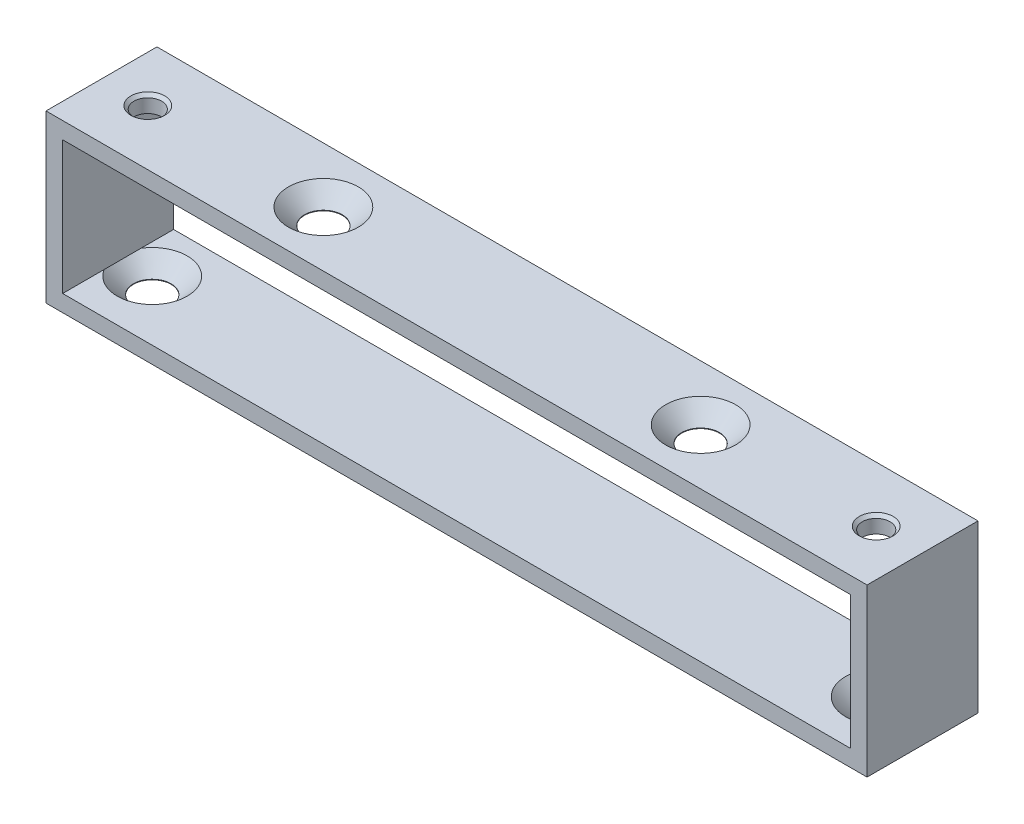
ISO-10303-21;
HEADER;
FILE_DESCRIPTION(('STEP AP214'),'2;1');
FILE_NAME('part.step','',(''),(''),'','','');
FILE_SCHEMA(('AUTOMOTIVE_DESIGN { 1 0 10303 214 1 1 1 1 }'));
ENDSEC;
DATA;
#1=APPLICATION_CONTEXT('core data for automotive mechanical design processes');
#2=APPLICATION_PROTOCOL_DEFINITION('international standard','automotive_design',2000,#1);
#3=PRODUCT_CONTEXT('',#1,'mechanical');
#4=PRODUCT('Part','Part','',(#3));
#5=PRODUCT_RELATED_PRODUCT_CATEGORY('part','',(#4));
#6=PRODUCT_DEFINITION_FORMATION('','',#4);
#7=PRODUCT_DEFINITION_CONTEXT('part definition',#1,'design');
#8=PRODUCT_DEFINITION('design','',#6,#7);
#9=PRODUCT_DEFINITION_SHAPE('','',#8);
#10=(LENGTH_UNIT() NAMED_UNIT(*) SI_UNIT(.MILLI.,.METRE.));
#11=(NAMED_UNIT(*) PLANE_ANGLE_UNIT() SI_UNIT($,.RADIAN.));
#12=(NAMED_UNIT(*) SI_UNIT($,.STERADIAN.) SOLID_ANGLE_UNIT());
#13=UNCERTAINTY_MEASURE_WITH_UNIT(LENGTH_MEASURE(1.E-05),#10,'distance_accuracy_value','');
#14=(GEOMETRIC_REPRESENTATION_CONTEXT(3) GLOBAL_UNCERTAINTY_ASSIGNED_CONTEXT((#13)) GLOBAL_UNIT_ASSIGNED_CONTEXT((#10,
#11,#12)) REPRESENTATION_CONTEXT('',''));
#15=CARTESIAN_POINT('',(0.,0.,0.));
#16=DIRECTION('',(0.,0.,1.));
#17=DIRECTION('',(1.,0.,0.));
#18=AXIS2_PLACEMENT_3D('',#15,#16,#17);
#19=CARTESIAN_POINT('',(-15.1079019313872,-9.8448275862069,-0.000999999999999265));
#20=DIRECTION('',(0.,-1.,0.));
#21=DIRECTION('',(0.,0.,-1.));
#22=AXIS2_PLACEMENT_3D('',#19,#20,#21);
#23=PLANE('',#22);
#24=CARTESIAN_POINT('',(-12.4329019313872,-9.8448275862069,4.6));
#25=DIRECTION('',(0.,1.,0.));
#26=DIRECTION('',(0.,0.,1.));
#27=AXIS2_PLACEMENT_3D('',#24,#25,#26);
#28=CIRCLE('',#27,3.15);
#29=CARTESIAN_POINT('',(-15.1079019313872,-9.8448275862069,6.26339261751397));
#30=VERTEX_POINT('',#29);
#31=CARTESIAN_POINT('',(-15.1079019313872,-9.8448275862069,2.93660738248603));
#32=VERTEX_POINT('',#31);
#33=EDGE_CURVE('E117',#30,#32,#28,.T.);
#34=ORIENTED_EDGE('',*,*,#33,.F.);
#35=DIRECTION('',(0.,0.,1.));
#36=VECTOR('',#35,1.);
#37=CARTESIAN_POINT('',(-15.1079019313872,-9.8448275862069,-0.000999999999999265));
#38=LINE('',#37,#36);
#39=CARTESIAN_POINT('',(-15.1079019313872,-9.8448275862069,10.));
#40=VERTEX_POINT('',#39);
#41=EDGE_CURVE('E136',#30,#40,#38,.T.);
#42=ORIENTED_EDGE('',*,*,#41,.T.);
#43=DIRECTION('',(1.,0.,0.));
#44=VECTOR('',#43,1.);
#45=CARTESIAN_POINT('',(-15.1079019313872,-9.8448275862069,10.));
#46=LINE('',#45,#44);
#47=CARTESIAN_POINT('',(55.8920980686128,-9.8448275862069,10.));
#48=VERTEX_POINT('',#47);
#49=EDGE_CURVE('E162',#40,#48,#46,.T.);
#50=ORIENTED_EDGE('',*,*,#49,.T.);
#51=DIRECTION('',(0.,0.,1.));
#52=VECTOR('',#51,1.);
#53=CARTESIAN_POINT('',(55.8920980686128,-9.8448275862069,-0.000999999999999265));
#54=LINE('',#53,#52);
#55=CARTESIAN_POINT('',(55.8920980686128,-9.8448275862069,6.26339261751398));
#56=VERTEX_POINT('',#55);
#57=EDGE_CURVE('E144',#56,#48,#54,.T.);
#58=ORIENTED_EDGE('',*,*,#57,.F.);
#59=CARTESIAN_POINT('',(53.2170980686128,-9.8448275862069,4.6));
#60=DIRECTION('',(0.,1.,0.));
#61=DIRECTION('',(0.,0.,1.));
#62=AXIS2_PLACEMENT_3D('',#59,#60,#61);
#63=CIRCLE('',#62,3.15);
#64=CARTESIAN_POINT('',(55.8920980686128,-9.8448275862069,2.93660738248602));
#65=VERTEX_POINT('',#64);
#66=EDGE_CURVE('E181',#65,#56,#63,.T.);
#67=ORIENTED_EDGE('',*,*,#66,.F.);
#68=CARTESIAN_POINT('',(55.8920980686128,-9.8448275862069,0.));
#69=VERTEX_POINT('',#68);
#70=EDGE_CURVE('E148',#69,#65,#54,.T.);
#71=ORIENTED_EDGE('',*,*,#70,.F.);
#72=DIRECTION('',(-1.,0.,0.));
#73=VECTOR('',#72,1.);
#74=CARTESIAN_POINT('',(-15.1079019313872,-9.8448275862069,0.));
#75=LINE('',#74,#73);
#76=CARTESIAN_POINT('',(-15.1079019313872,-9.8448275862069,0.));
#77=VERTEX_POINT('',#76);
#78=EDGE_CURVE('E141',#69,#77,#75,.T.);
#79=ORIENTED_EDGE('',*,*,#78,.T.);
#80=EDGE_CURVE('E133',#77,#32,#38,.T.);
#81=ORIENTED_EDGE('',*,*,#80,.T.);
#82=EDGE_LOOP('',(#34,#42,#50,#58,#67,#71,#79,#81));
#83=FACE_BOUND('',#82,.T.);
#84=ADVANCED_FACE('F41',(#83),#23,.F.);
#85=CARTESIAN_POINT('',(-16.6079019313872,3.6551724137931,10.));
#86=DIRECTION('',(0.,-1.,0.));
#87=DIRECTION('',(0.,0.,-1.));
#88=AXIS2_PLACEMENT_3D('',#85,#86,#87);
#89=PLANE('',#88);
#90=CARTESIAN_POINT('',(-12.4329019313872,3.6551724137931,5.));
#91=DIRECTION('',(0.,1.,0.));
#92=DIRECTION('',(0.,0.,1.));
#93=AXIS2_PLACEMENT_3D('',#90,#91,#92);
#94=CIRCLE('',#93,1.525);
#95=CARTESIAN_POINT('',(-12.4329019313872,3.6551724137931,6.525));
#96=VERTEX_POINT('',#95);
#97=EDGE_CURVE('E211',#96,#96,#94,.T.);
#98=ORIENTED_EDGE('',*,*,#97,.F.);
#99=EDGE_LOOP('',(#98));
#100=FACE_BOUND('',#99,.T.);
#101=DIRECTION('',(-1.,0.,0.));
#102=VECTOR('',#101,1.);
#103=CARTESIAN_POINT('',(-16.6079019313872,3.6551724137931,0.));
#104=LINE('',#103,#102);
#105=CARTESIAN_POINT('',(57.3920980686128,3.6551724137931,0.));
#106=VERTEX_POINT('',#105);
#107=CARTESIAN_POINT('',(-16.6079019313872,3.6551724137931,0.));
#108=VERTEX_POINT('',#107);
#109=EDGE_CURVE('E283',#106,#108,#104,.T.);
#110=ORIENTED_EDGE('',*,*,#109,.T.);
#111=DIRECTION('',(0.,0.,-1.));
#112=VECTOR('',#111,1.);
#113=CARTESIAN_POINT('',(-16.6079019313872,3.6551724137931,10.));
#114=LINE('',#113,#112);
#115=CARTESIAN_POINT('',(-16.6079019313872,3.6551724137931,10.));
#116=VERTEX_POINT('',#115);
#117=EDGE_CURVE('E291',#116,#108,#114,.T.);
#118=ORIENTED_EDGE('',*,*,#117,.F.);
#119=DIRECTION('',(-1.,0.,0.));
#120=VECTOR('',#119,1.);
#121=CARTESIAN_POINT('',(-16.6079019313872,3.6551724137931,10.));
#122=LINE('',#121,#120);
#123=CARTESIAN_POINT('',(57.3920980686128,3.6551724137931,10.));
#124=VERTEX_POINT('',#123);
#125=EDGE_CURVE('E289',#124,#116,#122,.T.);
#126=ORIENTED_EDGE('',*,*,#125,.F.);
#127=DIRECTION('',(0.,0.,-1.));
#128=VECTOR('',#127,1.);
#129=CARTESIAN_POINT('',(57.3920980686128,3.6551724137931,10.));
#130=LINE('',#129,#128);
#131=EDGE_CURVE('E303',#124,#106,#130,.T.);
#132=ORIENTED_EDGE('',*,*,#131,.T.);
#133=EDGE_LOOP('',(#110,#118,#126,#132));
#134=FACE_BOUND('',#133,.T.);
#135=CARTESIAN_POINT('',(37.3920980686128,3.6551724137931,5.));
#136=DIRECTION('',(0.,1.,0.));
#137=DIRECTION('',(0.,0.,1.));
#138=AXIS2_PLACEMENT_3D('',#135,#136,#137);
#139=CIRCLE('',#138,3.15);
#140=CARTESIAN_POINT('',(37.3920980686128,3.6551724137931,8.15));
#141=VERTEX_POINT('',#140);
#142=EDGE_CURVE('E235',#141,#141,#139,.T.);
#143=ORIENTED_EDGE('',*,*,#142,.F.);
#144=EDGE_LOOP('',(#143));
#145=FACE_BOUND('',#144,.T.);
#146=CARTESIAN_POINT('',(3.39209806861276,3.6551724137931,5.));
#147=DIRECTION('',(0.,1.,0.));
#148=DIRECTION('',(0.,0.,1.));
#149=AXIS2_PLACEMENT_3D('',#146,#147,#148);
#150=CIRCLE('',#149,3.15);
#151=CARTESIAN_POINT('',(3.39209806861276,3.6551724137931,8.15));
#152=VERTEX_POINT('',#151);
#153=EDGE_CURVE('E223',#152,#152,#150,.T.);
#154=ORIENTED_EDGE('',*,*,#153,.F.);
#155=EDGE_LOOP('',(#154));
#156=FACE_BOUND('',#155,.T.);
#157=CARTESIAN_POINT('',(53.2170980686128,3.6551724137931,5.));
#158=DIRECTION('',(0.,1.,0.));
#159=DIRECTION('',(0.,0.,1.));
#160=AXIS2_PLACEMENT_3D('',#157,#158,#159);
#161=CIRCLE('',#160,1.525);
#162=CARTESIAN_POINT('',(53.2170980686128,3.6551724137931,6.525));
#163=VERTEX_POINT('',#162);
#164=EDGE_CURVE('E199',#163,#163,#161,.T.);
#165=ORIENTED_EDGE('',*,*,#164,.F.);
#166=EDGE_LOOP('',(#165));
#167=FACE_BOUND('',#166,.T.);
#168=ADVANCED_FACE('F319',(#100,#134,#145,#156,#167),#89,.F.);
#169=CARTESIAN_POINT('',(-16.6079019313872,3.6551724137931,10.));
#170=DIRECTION('',(1.,0.,0.));
#171=DIRECTION('',(0.,1.,0.));
#172=AXIS2_PLACEMENT_3D('',#169,#170,#171);
#173=PLANE('',#172);
#174=DIRECTION('',(0.,-1.,0.));
#175=VECTOR('',#174,1.);
#176=CARTESIAN_POINT('',(-16.6079019313872,3.6551724137931,0.));
#177=LINE('',#176,#175);
#178=CARTESIAN_POINT('',(-16.6079019313872,-11.3448275862069,0.));
#179=VERTEX_POINT('',#178);
#180=EDGE_CURVE('E272',#108,#179,#177,.T.);
#181=ORIENTED_EDGE('',*,*,#180,.T.);
#182=DIRECTION('',(0.,0.,-1.));
#183=VECTOR('',#182,1.);
#184=CARTESIAN_POINT('',(-16.6079019313872,-11.3448275862069,10.));
#185=LINE('',#184,#183);
#186=CARTESIAN_POINT('',(-16.6079019313872,-11.3448275862069,10.));
#187=VERTEX_POINT('',#186);
#188=EDGE_CURVE('E11',#187,#179,#185,.T.);
#189=ORIENTED_EDGE('',*,*,#188,.F.);
#190=DIRECTION('',(0.,-1.,0.));
#191=VECTOR('',#190,1.);
#192=CARTESIAN_POINT('',(-16.6079019313872,3.6551724137931,10.));
#193=LINE('',#192,#191);
#194=EDGE_CURVE('E278',#116,#187,#193,.T.);
#195=ORIENTED_EDGE('',*,*,#194,.F.);
#196=ORIENTED_EDGE('',*,*,#117,.T.);
#197=EDGE_LOOP('',(#181,#189,#195,#196));
#198=FACE_BOUND('',#197,.T.);
#199=ADVANCED_FACE('F43',(#198),#173,.F.);
#200=CARTESIAN_POINT('',(-16.6079019313872,-11.3448275862069,10.));
#201=DIRECTION('',(0.,1.,0.));
#202=DIRECTION('',(0.,0.,1.));
#203=AXIS2_PLACEMENT_3D('',#200,#201,#202);
#204=PLANE('',#203);
#205=CARTESIAN_POINT('',(-12.4329019313872,-11.3448275862069,4.6));
#206=DIRECTION('',(0.,1.,0.));
#207=DIRECTION('',(0.,0.,1.));
#208=AXIS2_PLACEMENT_3D('',#205,#206,#207);
#209=CIRCLE('',#208,1.7);
#210=CARTESIAN_POINT('',(-12.4329019313872,-11.3448275862069,6.3));
#211=VERTEX_POINT('',#210);
#212=EDGE_CURVE('E183',#211,#211,#209,.T.);
#213=ORIENTED_EDGE('',*,*,#212,.T.);
#214=EDGE_LOOP('',(#213));
#215=FACE_BOUND('',#214,.T.);
#216=CARTESIAN_POINT('',(53.2170980686128,-11.3448275862069,4.6));
#217=DIRECTION('',(0.,1.,0.));
#218=DIRECTION('',(0.,0.,1.));
#219=AXIS2_PLACEMENT_3D('',#216,#217,#218);
#220=CIRCLE('',#219,1.7);
#221=CARTESIAN_POINT('',(53.2170980686128,-11.3448275862069,6.3));
#222=VERTEX_POINT('',#221);
#223=EDGE_CURVE('E195',#222,#222,#220,.T.);
#224=ORIENTED_EDGE('',*,*,#223,.T.);
#225=EDGE_LOOP('',(#224));
#226=FACE_BOUND('',#225,.T.);
#227=DIRECTION('',(1.,0.,0.));
#228=VECTOR('',#227,1.);
#229=CARTESIAN_POINT('',(-16.6079019313872,-11.3448275862069,0.));
#230=LINE('',#229,#228);
#231=CARTESIAN_POINT('',(57.3920980686128,-11.3448275862069,0.));
#232=VERTEX_POINT('',#231);
#233=EDGE_CURVE('E275',#179,#232,#230,.T.);
#234=ORIENTED_EDGE('',*,*,#233,.T.);
#235=DIRECTION('',(0.,0.,-1.));
#236=VECTOR('',#235,1.);
#237=CARTESIAN_POINT('',(57.3920980686128,-11.3448275862069,10.));
#238=LINE('',#237,#236);
#239=CARTESIAN_POINT('',(57.3920980686128,-11.3448275862069,10.));
#240=VERTEX_POINT('',#239);
#241=EDGE_CURVE('E50',#240,#232,#238,.T.);
#242=ORIENTED_EDGE('',*,*,#241,.F.);
#243=DIRECTION('',(1.,0.,0.));
#244=VECTOR('',#243,1.);
#245=CARTESIAN_POINT('',(-16.6079019313872,-11.3448275862069,10.));
#246=LINE('',#245,#244);
#247=EDGE_CURVE('E282',#187,#240,#246,.T.);
#248=ORIENTED_EDGE('',*,*,#247,.F.);
#249=ORIENTED_EDGE('',*,*,#188,.T.);
#250=EDGE_LOOP('',(#234,#242,#248,#249));
#251=FACE_BOUND('',#250,.T.);
#252=ADVANCED_FACE('F325',(#215,#226,#251),#204,.F.);
#253=CARTESIAN_POINT('',(57.3920980686128,3.6551724137931,10.));
#254=DIRECTION('',(-1.,0.,0.));
#255=DIRECTION('',(0.,0.,1.));
#256=AXIS2_PLACEMENT_3D('',#253,#254,#255);
#257=PLANE('',#256);
#258=DIRECTION('',(0.,1.,0.));
#259=VECTOR('',#258,1.);
#260=CARTESIAN_POINT('',(57.3920980686128,3.6551724137931,0.));
#261=LINE('',#260,#259);
#262=EDGE_CURVE('E295',#232,#106,#261,.T.);
#263=ORIENTED_EDGE('',*,*,#262,.T.);
#264=ORIENTED_EDGE('',*,*,#131,.F.);
#265=DIRECTION('',(0.,1.,0.));
#266=VECTOR('',#265,1.);
#267=CARTESIAN_POINT('',(57.3920980686128,3.6551724137931,10.));
#268=LINE('',#267,#266);
#269=EDGE_CURVE('E286',#240,#124,#268,.T.);
#270=ORIENTED_EDGE('',*,*,#269,.F.);
#271=ORIENTED_EDGE('',*,*,#241,.T.);
#272=EDGE_LOOP('',(#263,#264,#270,#271));
#273=FACE_BOUND('',#272,.T.);
#274=ADVANCED_FACE('F312',(#273),#257,.F.);
#275=CARTESIAN_POINT('',(0.,0.,10.));
#276=DIRECTION('',(0.,0.,1.));
#277=DIRECTION('',(1.,0.,0.));
#278=AXIS2_PLACEMENT_3D('',#275,#276,#277);
#279=PLANE('',#278);
#280=DIRECTION('',(0.,-1.,0.));
#281=VECTOR('',#280,1.);
#282=CARTESIAN_POINT('',(-15.1079019313872,2.1551724137931,10.));
#283=LINE('',#282,#281);
#284=CARTESIAN_POINT('',(-15.1079019313872,2.1551724137931,10.));
#285=VERTEX_POINT('',#284);
#286=EDGE_CURVE('E257',#285,#40,#283,.T.);
#287=ORIENTED_EDGE('',*,*,#286,.F.);
#288=DIRECTION('',(-1.,0.,0.));
#289=VECTOR('',#288,1.);
#290=CARTESIAN_POINT('',(-15.1079019313872,2.1551724137931,10.));
#291=LINE('',#290,#289);
#292=CARTESIAN_POINT('',(55.8920980686128,2.1551724137931,10.));
#293=VERTEX_POINT('',#292);
#294=EDGE_CURVE('E151',#293,#285,#291,.T.);
#295=ORIENTED_EDGE('',*,*,#294,.F.);
#296=DIRECTION('',(0.,1.,0.));
#297=VECTOR('',#296,1.);
#298=CARTESIAN_POINT('',(55.8920980686128,2.1551724137931,10.));
#299=LINE('',#298,#297);
#300=EDGE_CURVE('E155',#48,#293,#299,.T.);
#301=ORIENTED_EDGE('',*,*,#300,.F.);
#302=ORIENTED_EDGE('',*,*,#49,.F.);
#303=EDGE_LOOP('',(#287,#295,#301,#302));
#304=FACE_BOUND('',#303,.T.);
#305=ORIENTED_EDGE('',*,*,#194,.T.);
#306=ORIENTED_EDGE('',*,*,#247,.T.);
#307=ORIENTED_EDGE('',*,*,#269,.T.);
#308=ORIENTED_EDGE('',*,*,#125,.T.);
#309=EDGE_LOOP('',(#305,#306,#307,#308));
#310=FACE_BOUND('',#309,.T.);
#311=ADVANCED_FACE('F263',(#304,#310),#279,.T.);
#312=CARTESIAN_POINT('',(0.,0.,0.));
#313=DIRECTION('',(0.,0.,1.));
#314=DIRECTION('',(1.,0.,0.));
#315=AXIS2_PLACEMENT_3D('',#312,#313,#314);
#316=PLANE('',#315);
#317=DIRECTION('',(1.,0.,0.));
#318=VECTOR('',#317,1.);
#319=CARTESIAN_POINT('',(-15.1079019313872,2.1551724137931,0.));
#320=LINE('',#319,#318);
#321=CARTESIAN_POINT('',(-15.1079019313872,2.1551724137931,0.));
#322=VERTEX_POINT('',#321);
#323=CARTESIAN_POINT('',(55.8920980686128,2.1551724137931,0.));
#324=VERTEX_POINT('',#323);
#325=EDGE_CURVE('E250',#322,#324,#320,.T.);
#326=ORIENTED_EDGE('',*,*,#325,.F.);
#327=DIRECTION('',(0.,1.,0.));
#328=VECTOR('',#327,1.);
#329=CARTESIAN_POINT('',(-15.1079019313872,2.1551724137931,0.));
#330=LINE('',#329,#328);
#331=EDGE_CURVE('E254',#77,#322,#330,.T.);
#332=ORIENTED_EDGE('',*,*,#331,.F.);
#333=ORIENTED_EDGE('',*,*,#78,.F.);
#334=DIRECTION('',(0.,-1.,0.));
#335=VECTOR('',#334,1.);
#336=CARTESIAN_POINT('',(55.8920980686128,2.1551724137931,0.));
#337=LINE('',#336,#335);
#338=EDGE_CURVE('E247',#324,#69,#337,.T.);
#339=ORIENTED_EDGE('',*,*,#338,.F.);
#340=EDGE_LOOP('',(#326,#332,#333,#339));
#341=FACE_BOUND('',#340,.T.);
#342=ORIENTED_EDGE('',*,*,#180,.F.);
#343=ORIENTED_EDGE('',*,*,#109,.F.);
#344=ORIENTED_EDGE('',*,*,#262,.F.);
#345=ORIENTED_EDGE('',*,*,#233,.F.);
#346=EDGE_LOOP('',(#342,#343,#344,#345));
#347=FACE_BOUND('',#346,.T.);
#348=ADVANCED_FACE('F269',(#341,#347),#316,.F.);
#349=CARTESIAN_POINT('',(-15.1079019313872,2.1551724137931,-0.000999999999999265));
#350=DIRECTION('',(-1.,0.,0.));
#351=DIRECTION('',(0.,-1.,0.));
#352=AXIS2_PLACEMENT_3D('',#349,#350,#351);
#353=PLANE('',#352);
#354=ORIENTED_EDGE('',*,*,#331,.T.);
#355=DIRECTION('',(0.,0.,1.));
#356=VECTOR('',#355,1.);
#357=CARTESIAN_POINT('',(-15.1079019313872,2.1551724137931,-0.000999999999999265));
#358=LINE('',#357,#356);
#359=EDGE_CURVE('E166',#322,#285,#358,.T.);
#360=ORIENTED_EDGE('',*,*,#359,.T.);
#361=ORIENTED_EDGE('',*,*,#286,.T.);
#362=ORIENTED_EDGE('',*,*,#41,.F.);
#363=EDGE_CURVE('E127',#32,#30,#38,.T.);
#364=ORIENTED_EDGE('',*,*,#363,.F.);
#365=ORIENTED_EDGE('',*,*,#80,.F.);
#366=EDGE_LOOP('',(#354,#360,#361,#362,#364,#365));
#367=FACE_BOUND('',#366,.T.);
#368=ADVANCED_FACE('F132',(#367),#353,.F.);
#369=CARTESIAN_POINT('',(-15.1079019313872,2.1551724137931,-0.000999999999999265));
#370=DIRECTION('',(0.,1.,0.));
#371=DIRECTION('',(0.,0.,1.));
#372=AXIS2_PLACEMENT_3D('',#369,#370,#371);
#373=PLANE('',#372);
#374=CARTESIAN_POINT('',(53.2170980686128,2.1551724137931,5.));
#375=DIRECTION('',(0.,1.,0.));
#376=DIRECTION('',(0.,0.,1.));
#377=AXIS2_PLACEMENT_3D('',#374,#375,#376);
#378=CIRCLE('',#377,1.25);
#379=CARTESIAN_POINT('',(53.2170980686128,2.1551724137931,6.25));
#380=VERTEX_POINT('',#379);
#381=EDGE_CURVE('E207',#380,#380,#378,.T.);
#382=ORIENTED_EDGE('',*,*,#381,.T.);
#383=EDGE_LOOP('',(#382));
#384=FACE_BOUND('',#383,.T.);
#385=CARTESIAN_POINT('',(-12.4329019313872,2.1551724137931,5.));
#386=DIRECTION('',(0.,1.,0.));
#387=DIRECTION('',(0.,0.,1.));
#388=AXIS2_PLACEMENT_3D('',#385,#386,#387);
#389=CIRCLE('',#388,1.25);
#390=CARTESIAN_POINT('',(-12.4329019313872,2.1551724137931,6.25));
#391=VERTEX_POINT('',#390);
#392=EDGE_CURVE('E219',#391,#391,#389,.T.);
#393=ORIENTED_EDGE('',*,*,#392,.T.);
#394=EDGE_LOOP('',(#393));
#395=FACE_BOUND('',#394,.T.);
#396=CARTESIAN_POINT('',(3.39209806861276,2.1551724137931,5.));
#397=DIRECTION('',(0.,1.,0.));
#398=DIRECTION('',(0.,0.,1.));
#399=AXIS2_PLACEMENT_3D('',#396,#397,#398);
#400=CIRCLE('',#399,1.7);
#401=CARTESIAN_POINT('',(3.39209806861276,2.1551724137931,6.7));
#402=VERTEX_POINT('',#401);
#403=EDGE_CURVE('E231',#402,#402,#400,.T.);
#404=ORIENTED_EDGE('',*,*,#403,.T.);
#405=EDGE_LOOP('',(#404));
#406=FACE_BOUND('',#405,.T.);
#407=CARTESIAN_POINT('',(37.3920980686128,2.1551724137931,5.));
#408=DIRECTION('',(0.,1.,0.));
#409=DIRECTION('',(0.,0.,1.));
#410=AXIS2_PLACEMENT_3D('',#407,#408,#409);
#411=CIRCLE('',#410,1.7);
#412=CARTESIAN_POINT('',(37.3920980686128,2.1551724137931,6.7));
#413=VERTEX_POINT('',#412);
#414=EDGE_CURVE('E243',#413,#413,#411,.T.);
#415=ORIENTED_EDGE('',*,*,#414,.T.);
#416=EDGE_LOOP('',(#415));
#417=FACE_BOUND('',#416,.T.);
#418=ORIENTED_EDGE('',*,*,#325,.T.);
#419=DIRECTION('',(0.,0.,1.));
#420=VECTOR('',#419,1.);
#421=CARTESIAN_POINT('',(55.8920980686128,2.1551724137931,-0.000999999999999265));
#422=LINE('',#421,#420);
#423=EDGE_CURVE('E169',#324,#293,#422,.T.);
#424=ORIENTED_EDGE('',*,*,#423,.T.);
#425=ORIENTED_EDGE('',*,*,#294,.T.);
#426=ORIENTED_EDGE('',*,*,#359,.F.);
#427=EDGE_LOOP('',(#418,#424,#425,#426));
#428=FACE_BOUND('',#427,.T.);
#429=ADVANCED_FACE('F267',(#384,#395,#406,#417,#428),#373,.F.);
#430=CARTESIAN_POINT('',(55.8920980686128,2.1551724137931,-0.000999999999999265));
#431=DIRECTION('',(1.,0.,0.));
#432=DIRECTION('',(0.,1.,0.));
#433=AXIS2_PLACEMENT_3D('',#430,#431,#432);
#434=PLANE('',#433);
#435=ORIENTED_EDGE('',*,*,#338,.T.);
#436=ORIENTED_EDGE('',*,*,#70,.T.);
#437=EDGE_CURVE('E146',#65,#56,#54,.T.);
#438=ORIENTED_EDGE('',*,*,#437,.T.);
#439=ORIENTED_EDGE('',*,*,#57,.T.);
#440=ORIENTED_EDGE('',*,*,#300,.T.);
#441=ORIENTED_EDGE('',*,*,#423,.F.);
#442=EDGE_LOOP('',(#435,#436,#438,#439,#440,#441));
#443=FACE_BOUND('',#442,.T.);
#444=ADVANCED_FACE('F176',(#443),#434,.F.);
#445=CARTESIAN_POINT('',(37.3920980686128,3.6551724137931,5.));
#446=DIRECTION('',(0.,1.,0.));
#447=DIRECTION('',(0.,0.,1.));
#448=AXIS2_PLACEMENT_3D('',#445,#446,#447);
#449=CYLINDRICAL_SURFACE('',#448,1.7);
#450=ORIENTED_EDGE('',*,*,#414,.F.);
#451=EDGE_LOOP('',(#450));
#452=FACE_BOUND('',#451,.T.);
#453=CARTESIAN_POINT('',(37.3920980686128,2.2051724137931,5.));
#454=DIRECTION('',(0.,1.,0.));
#455=DIRECTION('',(0.,0.,1.));
#456=AXIS2_PLACEMENT_3D('',#453,#454,#455);
#457=CIRCLE('',#456,1.7);
#458=CARTESIAN_POINT('',(37.3920980686128,2.2051724137931,6.7));
#459=VERTEX_POINT('',#458);
#460=EDGE_CURVE('E239',#459,#459,#457,.T.);
#461=ORIENTED_EDGE('',*,*,#460,.T.);
#462=EDGE_LOOP('',(#461));
#463=FACE_BOUND('',#462,.T.);
#464=ADVANCED_FACE('F372',(#452,#463),#449,.F.);
#465=CARTESIAN_POINT('',(37.3920980686128,3.6551724137931,5.));
#466=DIRECTION('',(0.,1.,0.));
#467=DIRECTION('',(0.,0.,1.));
#468=AXIS2_PLACEMENT_3D('',#465,#466,#467);
#469=CONICAL_SURFACE('',#468,3.15,0.785398163397447);
#470=ORIENTED_EDGE('',*,*,#460,.F.);
#471=EDGE_LOOP('',(#470));
#472=FACE_BOUND('',#471,.T.);
#473=ORIENTED_EDGE('',*,*,#142,.T.);
#474=EDGE_LOOP('',(#473));
#475=FACE_BOUND('',#474,.T.);
#476=ADVANCED_FACE('F378',(#472,#475),#469,.F.);
#477=CARTESIAN_POINT('',(3.39209806861276,3.6551724137931,5.));
#478=DIRECTION('',(0.,1.,0.));
#479=DIRECTION('',(0.,0.,1.));
#480=AXIS2_PLACEMENT_3D('',#477,#478,#479);
#481=CYLINDRICAL_SURFACE('',#480,1.7);
#482=ORIENTED_EDGE('',*,*,#403,.F.);
#483=EDGE_LOOP('',(#482));
#484=FACE_BOUND('',#483,.T.);
#485=CARTESIAN_POINT('',(3.39209806861276,2.2051724137931,5.));
#486=DIRECTION('',(0.,1.,0.));
#487=DIRECTION('',(0.,0.,1.));
#488=AXIS2_PLACEMENT_3D('',#485,#486,#487);
#489=CIRCLE('',#488,1.7);
#490=CARTESIAN_POINT('',(3.39209806861276,2.2051724137931,6.7));
#491=VERTEX_POINT('',#490);
#492=EDGE_CURVE('E227',#491,#491,#489,.T.);
#493=ORIENTED_EDGE('',*,*,#492,.T.);
#494=EDGE_LOOP('',(#493));
#495=FACE_BOUND('',#494,.T.);
#496=ADVANCED_FACE('F386',(#484,#495),#481,.F.);
#497=CARTESIAN_POINT('',(3.39209806861276,3.6551724137931,5.));
#498=DIRECTION('',(0.,1.,0.));
#499=DIRECTION('',(0.,0.,1.));
#500=AXIS2_PLACEMENT_3D('',#497,#498,#499);
#501=CONICAL_SURFACE('',#500,3.15,0.785398163397447);
#502=ORIENTED_EDGE('',*,*,#492,.F.);
#503=EDGE_LOOP('',(#502));
#504=FACE_BOUND('',#503,.T.);
#505=ORIENTED_EDGE('',*,*,#153,.T.);
#506=EDGE_LOOP('',(#505));
#507=FACE_BOUND('',#506,.T.);
#508=ADVANCED_FACE('F394',(#504,#507),#501,.F.);
#509=CARTESIAN_POINT('',(-12.4329019313872,3.6551724137931,5.));
#510=DIRECTION('',(0.,1.,0.));
#511=DIRECTION('',(0.,0.,1.));
#512=AXIS2_PLACEMENT_3D('',#509,#510,#511);
#513=CYLINDRICAL_SURFACE('',#512,1.25);
#514=ORIENTED_EDGE('',*,*,#392,.F.);
#515=EDGE_LOOP('',(#514));
#516=FACE_BOUND('',#515,.T.);
#517=CARTESIAN_POINT('',(-12.4329019313872,3.3801724137931,5.));
#518=DIRECTION('',(0.,1.,0.));
#519=DIRECTION('',(0.,0.,1.));
#520=AXIS2_PLACEMENT_3D('',#517,#518,#519);
#521=CIRCLE('',#520,1.25);
#522=CARTESIAN_POINT('',(-12.4329019313872,3.3801724137931,6.25));
#523=VERTEX_POINT('',#522);
#524=EDGE_CURVE('E215',#523,#523,#521,.T.);
#525=ORIENTED_EDGE('',*,*,#524,.T.);
#526=EDGE_LOOP('',(#525));
#527=FACE_BOUND('',#526,.T.);
#528=ADVANCED_FACE('F402',(#516,#527),#513,.F.);
#529=CARTESIAN_POINT('',(-12.4329019313872,3.6551724137931,5.));
#530=DIRECTION('',(0.,1.,0.));
#531=DIRECTION('',(0.,0.,1.));
#532=AXIS2_PLACEMENT_3D('',#529,#530,#531);
#533=CONICAL_SURFACE('',#532,1.525,0.785398163397448);
#534=ORIENTED_EDGE('',*,*,#524,.F.);
#535=EDGE_LOOP('',(#534));
#536=FACE_BOUND('',#535,.T.);
#537=ORIENTED_EDGE('',*,*,#97,.T.);
#538=EDGE_LOOP('',(#537));
#539=FACE_BOUND('',#538,.T.);
#540=ADVANCED_FACE('F410',(#536,#539),#533,.F.);
#541=CARTESIAN_POINT('',(53.2170980686128,3.6551724137931,5.));
#542=DIRECTION('',(0.,1.,0.));
#543=DIRECTION('',(0.,0.,1.));
#544=AXIS2_PLACEMENT_3D('',#541,#542,#543);
#545=CYLINDRICAL_SURFACE('',#544,1.25);
#546=ORIENTED_EDGE('',*,*,#381,.F.);
#547=EDGE_LOOP('',(#546));
#548=FACE_BOUND('',#547,.T.);
#549=CARTESIAN_POINT('',(53.2170980686128,3.3801724137931,5.));
#550=DIRECTION('',(0.,1.,0.));
#551=DIRECTION('',(0.,0.,1.));
#552=AXIS2_PLACEMENT_3D('',#549,#550,#551);
#553=CIRCLE('',#552,1.25);
#554=CARTESIAN_POINT('',(53.2170980686128,3.3801724137931,6.25));
#555=VERTEX_POINT('',#554);
#556=EDGE_CURVE('E203',#555,#555,#553,.T.);
#557=ORIENTED_EDGE('',*,*,#556,.T.);
#558=EDGE_LOOP('',(#557));
#559=FACE_BOUND('',#558,.T.);
#560=ADVANCED_FACE('F418',(#548,#559),#545,.F.);
#561=CARTESIAN_POINT('',(53.2170980686128,3.6551724137931,5.));
#562=DIRECTION('',(0.,1.,0.));
#563=DIRECTION('',(0.,0.,1.));
#564=AXIS2_PLACEMENT_3D('',#561,#562,#563);
#565=CONICAL_SURFACE('',#564,1.525,0.785398163397442);
#566=ORIENTED_EDGE('',*,*,#556,.F.);
#567=EDGE_LOOP('',(#566));
#568=FACE_BOUND('',#567,.T.);
#569=ORIENTED_EDGE('',*,*,#164,.T.);
#570=EDGE_LOOP('',(#569));
#571=FACE_BOUND('',#570,.T.);
#572=ADVANCED_FACE('F426',(#568,#571),#565,.F.);
#573=CARTESIAN_POINT('',(56.3670980686128,-9.8448275862069,4.6));
#574=DIRECTION('',(0.,1.,0.));
#575=DIRECTION('',(0.,0.,1.));
#576=AXIS2_PLACEMENT_3D('',#573,#574,#575);
#577=PLANE('',#576);
#578=EDGE_CURVE('E63',#56,#65,#63,.T.);
#579=ORIENTED_EDGE('',*,*,#578,.F.);
#580=ORIENTED_EDGE('',*,*,#437,.F.);
#581=EDGE_LOOP('',(#579,#580));
#582=FACE_BOUND('',#581,.T.);
#583=ADVANCED_FACE('F180',(#582),#577,.F.);
#584=CARTESIAN_POINT('',(53.2170980686128,-9.8448275862069,4.6));
#585=DIRECTION('',(0.,1.,0.));
#586=DIRECTION('',(0.,0.,1.));
#587=AXIS2_PLACEMENT_3D('',#584,#585,#586);
#588=CYLINDRICAL_SURFACE('',#587,1.7);
#589=ORIENTED_EDGE('',*,*,#223,.F.);
#590=EDGE_LOOP('',(#589));
#591=FACE_BOUND('',#590,.T.);
#592=CARTESIAN_POINT('',(53.2170980686128,-11.2948275862069,4.6));
#593=DIRECTION('',(0.,1.,0.));
#594=DIRECTION('',(0.,0.,1.));
#595=AXIS2_PLACEMENT_3D('',#592,#593,#594);
#596=CIRCLE('',#595,1.7);
#597=CARTESIAN_POINT('',(53.2170980686128,-11.2948275862069,6.3));
#598=VERTEX_POINT('',#597);
#599=EDGE_CURVE('E187',#598,#598,#596,.T.);
#600=ORIENTED_EDGE('',*,*,#599,.T.);
#601=EDGE_LOOP('',(#600));
#602=FACE_BOUND('',#601,.T.);
#603=ADVANCED_FACE('F439',(#591,#602),#588,.F.);
#604=CARTESIAN_POINT('',(53.2170980686128,-9.8448275862069,4.6));
#605=DIRECTION('',(0.,1.,0.));
#606=DIRECTION('',(0.,0.,1.));
#607=AXIS2_PLACEMENT_3D('',#604,#605,#606);
#608=CONICAL_SURFACE('',#607,3.15,0.785398163397448);
#609=ORIENTED_EDGE('',*,*,#599,.F.);
#610=EDGE_LOOP('',(#609));
#611=FACE_BOUND('',#610,.T.);
#612=ORIENTED_EDGE('',*,*,#578,.T.);
#613=ORIENTED_EDGE('',*,*,#66,.T.);
#614=EDGE_LOOP('',(#612,#613));
#615=FACE_BOUND('',#614,.T.);
#616=ADVANCED_FACE('F446',(#611,#615),#608,.F.);
#617=CARTESIAN_POINT('',(-9.28290193138723,-9.8448275862069,4.6));
#618=DIRECTION('',(0.,1.,0.));
#619=DIRECTION('',(0.,0.,1.));
#620=AXIS2_PLACEMENT_3D('',#617,#618,#619);
#621=PLANE('',#620);
#622=EDGE_CURVE('E56',#32,#30,#28,.T.);
#623=ORIENTED_EDGE('',*,*,#622,.F.);
#624=ORIENTED_EDGE('',*,*,#363,.T.);
#625=EDGE_LOOP('',(#623,#624));
#626=FACE_BOUND('',#625,.T.);
#627=ADVANCED_FACE('F126',(#626),#621,.F.);
#628=CARTESIAN_POINT('',(-12.4329019313872,-9.8448275862069,4.6));
#629=DIRECTION('',(0.,1.,0.));
#630=DIRECTION('',(0.,0.,1.));
#631=AXIS2_PLACEMENT_3D('',#628,#629,#630);
#632=CYLINDRICAL_SURFACE('',#631,1.7);
#633=ORIENTED_EDGE('',*,*,#212,.F.);
#634=EDGE_LOOP('',(#633));
#635=FACE_BOUND('',#634,.T.);
#636=CARTESIAN_POINT('',(-12.4329019313872,-11.2948275862069,4.6));
#637=DIRECTION('',(0.,1.,0.));
#638=DIRECTION('',(0.,0.,1.));
#639=AXIS2_PLACEMENT_3D('',#636,#637,#638);
#640=CIRCLE('',#639,1.7);
#641=CARTESIAN_POINT('',(-12.4329019313872,-11.2948275862069,6.3));
#642=VERTEX_POINT('',#641);
#643=EDGE_CURVE('E129',#642,#642,#640,.T.);
#644=ORIENTED_EDGE('',*,*,#643,.T.);
#645=EDGE_LOOP('',(#644));
#646=FACE_BOUND('',#645,.T.);
#647=ADVANCED_FACE('F461',(#635,#646),#632,.F.);
#648=CARTESIAN_POINT('',(-12.4329019313872,-9.8448275862069,4.6));
#649=DIRECTION('',(0.,1.,0.));
#650=DIRECTION('',(0.,0.,1.));
#651=AXIS2_PLACEMENT_3D('',#648,#649,#650);
#652=CONICAL_SURFACE('',#651,3.15,0.785398163397448);
#653=ORIENTED_EDGE('',*,*,#643,.F.);
#654=EDGE_LOOP('',(#653));
#655=FACE_BOUND('',#654,.T.);
#656=ORIENTED_EDGE('',*,*,#622,.T.);
#657=ORIENTED_EDGE('',*,*,#33,.T.);
#658=EDGE_LOOP('',(#656,#657));
#659=FACE_BOUND('',#658,.T.);
#660=ADVANCED_FACE('F118',(#655,#659),#652,.F.);
#661=CLOSED_SHELL('',(#84,#168,#199,#252,#274,#311,#348,#368,#429,#444,#464,#476,#496,#508,#528,
#540,#560,#572,#583,#603,#616,#627,#647,#660));
#662=MANIFOLD_SOLID_BREP('B2',#661);
#663=ADVANCED_BREP_SHAPE_REPRESENTATION('',(#18,#662),#14);
#664=SHAPE_DEFINITION_REPRESENTATION(#9,#663);
ENDSEC;
END-ISO-10303-21;
